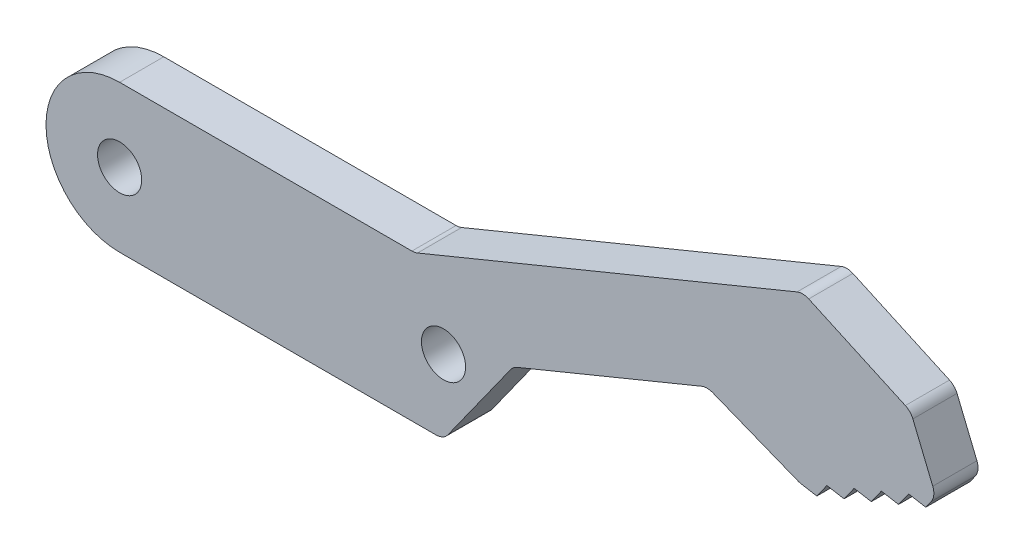
ISO-10303-21;
HEADER;
FILE_DESCRIPTION(('STEP AP214'),'2;1');
FILE_NAME('part.step','',(''),(''),'','','');
FILE_SCHEMA(('AUTOMOTIVE_DESIGN { 1 0 10303 214 1 1 1 1 }'));
ENDSEC;
DATA;
#1=APPLICATION_CONTEXT('core data for automotive mechanical design processes');
#2=APPLICATION_PROTOCOL_DEFINITION('international standard','automotive_design',2000,#1);
#3=PRODUCT_CONTEXT('',#1,'mechanical');
#4=PRODUCT('Part','Part','',(#3));
#5=PRODUCT_RELATED_PRODUCT_CATEGORY('part','',(#4));
#6=PRODUCT_DEFINITION_FORMATION('','',#4);
#7=PRODUCT_DEFINITION_CONTEXT('part definition',#1,'design');
#8=PRODUCT_DEFINITION('design','',#6,#7);
#9=PRODUCT_DEFINITION_SHAPE('','',#8);
#10=(LENGTH_UNIT() NAMED_UNIT(*) SI_UNIT(.MILLI.,.METRE.));
#11=(NAMED_UNIT(*) PLANE_ANGLE_UNIT() SI_UNIT($,.RADIAN.));
#12=(NAMED_UNIT(*) SI_UNIT($,.STERADIAN.) SOLID_ANGLE_UNIT());
#13=UNCERTAINTY_MEASURE_WITH_UNIT(LENGTH_MEASURE(1.E-05),#10,'distance_accuracy_value','');
#14=(GEOMETRIC_REPRESENTATION_CONTEXT(3) GLOBAL_UNCERTAINTY_ASSIGNED_CONTEXT((#13)) GLOBAL_UNIT_ASSIGNED_CONTEXT((#10,
#11,#12)) REPRESENTATION_CONTEXT('',''));
#15=CARTESIAN_POINT('',(0.,0.,0.));
#16=DIRECTION('',(0.,0.,1.));
#17=DIRECTION('',(1.,0.,0.));
#18=AXIS2_PLACEMENT_3D('',#15,#16,#17);
#19=CARTESIAN_POINT('',(16.9314341640703,-12.0952117619832,3.));
#20=DIRECTION('',(0.8137032336516,-0.581280523968359,0.));
#21=DIRECTION('',(0.581280523968359,0.8137032336516,0.));
#22=AXIS2_PLACEMENT_3D('',#19,#20,#21);
#23=PLANE('',#22);
#24=DIRECTION('',(-0.581280523968359,-0.8137032336516,0.));
#25=VECTOR('',#24,1.);
#26=CARTESIAN_POINT('',(16.9314341640703,-12.0952117619832,0.));
#27=LINE('',#26,#25);
#28=CARTESIAN_POINT('',(26.562618493048,1.38696338278455,0.));
#29=VERTEX_POINT('',#28);
#30=CARTESIAN_POINT('',(22.2991182366711,-4.58128052396836,0.));
#31=VERTEX_POINT('',#30);
#32=EDGE_CURVE('E359',#29,#31,#27,.T.);
#33=ORIENTED_EDGE('',*,*,#32,.F.);
#34=DIRECTION('',(0.,0.,-1.));
#35=VECTOR('',#34,1.);
#36=CARTESIAN_POINT('',(26.562618493048,1.38696338278455,3.));
#37=LINE('',#36,#35);
#38=CARTESIAN_POINT('',(26.562618493048,1.38696338278455,3.));
#39=VERTEX_POINT('',#38);
#40=EDGE_CURVE('E338',#29,#39,#37,.F.);
#41=ORIENTED_EDGE('',*,*,#40,.T.);
#42=DIRECTION('',(-0.581280523968359,-0.8137032336516,0.));
#43=VECTOR('',#42,1.);
#44=CARTESIAN_POINT('',(16.9314341640703,-12.0952117619832,3.));
#45=LINE('',#44,#43);
#46=CARTESIAN_POINT('',(22.2991182366711,-4.58128052396836,3.));
#47=VERTEX_POINT('',#46);
#48=EDGE_CURVE('E378',#39,#47,#45,.T.);
#49=ORIENTED_EDGE('',*,*,#48,.T.);
#50=DIRECTION('',(0.,0.,-1.));
#51=VECTOR('',#50,1.);
#52=CARTESIAN_POINT('',(22.2991182366711,-4.58128052396836,0.));
#53=LINE('',#52,#51);
#54=EDGE_CURVE('E334',#47,#31,#53,.T.);
#55=ORIENTED_EDGE('',*,*,#54,.T.);
#56=EDGE_LOOP('',(#33,#41,#49,#55));
#57=FACE_BOUND('',#56,.T.);
#58=ADVANCED_FACE('F42',(#57),#23,.T.);
#59=CARTESIAN_POINT('',(3.29500338314019,-8.0141207088459,3.));
#60=DIRECTION('',(0.380263412733194,-0.924878228166554,0.));
#61=DIRECTION('',(0.924878228166554,0.380263412733194,0.));
#62=AXIS2_PLACEMENT_3D('',#59,#60,#61);
#63=PLANE('',#62);
#64=DIRECTION('',(-0.924878228166555,-0.380263412733194,0.));
#65=VECTOR('',#64,1.);
#66=CARTESIAN_POINT('',(3.29500338314019,-8.0141207088459,0.));
#67=LINE('',#66,#65);
#68=CARTESIAN_POINT('',(39.526489329326,6.88244413040154,0.));
#69=VERTEX_POINT('',#68);
#70=CARTESIAN_POINT('',(26.9960583139664,1.73056108698275,0.));
#71=VERTEX_POINT('',#70);
#72=EDGE_CURVE('E361',#69,#71,#67,.T.);
#73=ORIENTED_EDGE('',*,*,#72,.F.);
#74=DIRECTION('',(0.,0.,-1.));
#75=VECTOR('',#74,1.);
#76=CARTESIAN_POINT('',(39.526489329326,6.88244413040154,3.));
#77=LINE('',#76,#75);
#78=CARTESIAN_POINT('',(39.526489329326,6.88244413040154,3.));
#79=VERTEX_POINT('',#78);
#80=EDGE_CURVE('E331',#69,#79,#77,.F.);
#81=ORIENTED_EDGE('',*,*,#80,.T.);
#82=DIRECTION('',(-0.924878228166555,-0.380263412733194,0.));
#83=VECTOR('',#82,1.);
#84=CARTESIAN_POINT('',(3.29500338314019,-8.0141207088459,3.));
#85=LINE('',#84,#83);
#86=CARTESIAN_POINT('',(26.9960583139664,1.73056108698275,3.));
#87=VERTEX_POINT('',#86);
#88=EDGE_CURVE('E376',#79,#87,#85,.T.);
#89=ORIENTED_EDGE('',*,*,#88,.T.);
#90=DIRECTION('',(0.,0.,-1.));
#91=VECTOR('',#90,1.);
#92=CARTESIAN_POINT('',(26.9960583139664,1.73056108698274,0.));
#93=LINE('',#92,#91);
#94=EDGE_CURVE('E327',#87,#71,#93,.T.);
#95=ORIENTED_EDGE('',*,*,#94,.T.);
#96=EDGE_LOOP('',(#73,#81,#89,#95));
#97=FACE_BOUND('',#96,.T.);
#98=ADVANCED_FACE('F380',(#97),#63,.T.);
#99=CARTESIAN_POINT('',(7.84369243763677,19.7605066346558,3.));
#100=DIRECTION('',(-0.368935795459596,-0.929454882621311,0.));
#101=DIRECTION('',(0.929454882621311,-0.368935795459596,0.));
#102=AXIS2_PLACEMENT_3D('',#99,#100,#101);
#103=PLANE('',#102);
#104=DIRECTION('',(-0.929454882621311,0.368935795459596,0.));
#105=VECTOR('',#104,1.);
#106=CARTESIAN_POINT('',(7.84369243763677,19.7605066346558,0.));
#107=LINE('',#106,#105);
#108=CARTESIAN_POINT('',(46.0925277874036,4.57809729018979,0.));
#109=VERTEX_POINT('',#108);
#110=CARTESIAN_POINT('',(40.2756885375188,6.88702078485629,0.));
#111=VERTEX_POINT('',#110);
#112=EDGE_CURVE('E454',#109,#111,#107,.T.);
#113=ORIENTED_EDGE('',*,*,#112,.F.);
#114=DIRECTION('',(0.,0.,-1.));
#115=VECTOR('',#114,1.);
#116=CARTESIAN_POINT('',(46.0925277874036,4.5780972901898,3.));
#117=LINE('',#116,#115);
#118=CARTESIAN_POINT('',(46.0925277874036,4.57809729018979,3.));
#119=VERTEX_POINT('',#118);
#120=EDGE_CURVE('E282',#109,#119,#117,.F.);
#121=ORIENTED_EDGE('',*,*,#120,.T.);
#122=DIRECTION('',(-0.929454882621311,0.368935795459596,0.));
#123=VECTOR('',#122,1.);
#124=CARTESIAN_POINT('',(7.84369243763677,19.7605066346558,3.));
#125=LINE('',#124,#123);
#126=CARTESIAN_POINT('',(40.2756885375188,6.88702078485629,3.));
#127=VERTEX_POINT('',#126);
#128=EDGE_CURVE('E237',#119,#127,#125,.T.);
#129=ORIENTED_EDGE('',*,*,#128,.T.);
#130=DIRECTION('',(0.,0.,-1.));
#131=VECTOR('',#130,1.);
#132=CARTESIAN_POINT('',(40.2756885375188,6.8870207848563,0.));
#133=LINE('',#132,#131);
#134=EDGE_CURVE('E278',#127,#111,#133,.T.);
#135=ORIENTED_EDGE('',*,*,#134,.T.);
#136=EDGE_LOOP('',(#113,#121,#129,#135));
#137=FACE_BOUND('',#136,.T.);
#138=ADVANCED_FACE('F633',(#137),#103,.T.);
#139=CARTESIAN_POINT('',(2.12068725055289,12.2001062019432,3.));
#140=DIRECTION('',(0.171257275030384,0.98522634239507,0.));
#141=DIRECTION('',(-0.98522634239507,0.171257275030384,0.));
#142=AXIS2_PLACEMENT_3D('',#139,#140,#141);
#143=PLANE('',#142);
#144=DIRECTION('',(0.98522634239507,-0.171257275030384,0.));
#145=VECTOR('',#144,1.);
#146=CARTESIAN_POINT('',(2.12068725055289,12.2001062019432,3.));
#147=LINE('',#146,#145);
#148=CARTESIAN_POINT('',(46.2902063078328,4.52232583041604,3.));
#149=VERTEX_POINT('',#148);
#150=CARTESIAN_POINT('',(47.3529322035688,4.33759717145069,3.));
#151=VERTEX_POINT('',#150);
#152=EDGE_CURVE('E223',#149,#151,#147,.T.);
#153=ORIENTED_EDGE('',*,*,#152,.F.);
#154=DIRECTION('',(0.,0.,-1.));
#155=VECTOR('',#154,1.);
#156=CARTESIAN_POINT('',(46.2902063078328,4.52232583041604,0.));
#157=LINE('',#156,#155);
#158=CARTESIAN_POINT('',(46.2902063078328,4.52232583041604,0.));
#159=VERTEX_POINT('',#158);
#160=EDGE_CURVE('E254',#149,#159,#157,.T.);
#161=ORIENTED_EDGE('',*,*,#160,.T.);
#162=DIRECTION('',(0.98522634239507,-0.171257275030384,0.));
#163=VECTOR('',#162,1.);
#164=CARTESIAN_POINT('',(2.12068725055289,12.2001062019432,0.));
#165=LINE('',#164,#163);
#166=CARTESIAN_POINT('',(47.3529322035688,4.33759717145069,0.));
#167=VERTEX_POINT('',#166);
#168=EDGE_CURVE('E251',#159,#167,#165,.T.);
#169=ORIENTED_EDGE('',*,*,#168,.T.);
#170=DIRECTION('',(0.,0.,-1.));
#171=VECTOR('',#170,1.);
#172=CARTESIAN_POINT('',(47.3529322035688,4.33759717145069,3.));
#173=LINE('',#172,#171);
#174=EDGE_CURVE('E243',#151,#167,#173,.T.);
#175=ORIENTED_EDGE('',*,*,#174,.F.);
#176=EDGE_LOOP('',(#153,#161,#169,#175));
#177=FACE_BOUND('',#176,.T.);
#178=ADVANCED_FACE('F249',(#177),#143,.F.);
#179=CARTESIAN_POINT('',(29.3832302084343,-20.9117468542213,3.));
#180=DIRECTION('',(-0.814732571298563,0.579836905746117,0.));
#181=DIRECTION('',(-0.579836905746118,-0.814732571298563,0.));
#182=AXIS2_PLACEMENT_3D('',#179,#180,#181);
#183=PLANE('',#182);
#184=DIRECTION('',(0.579836905746117,0.814732571298563,0.));
#185=VECTOR('',#184,1.);
#186=CARTESIAN_POINT('',(29.3832302084343,-20.9117468542213,0.));
#187=LINE('',#186,#185);
#188=CARTESIAN_POINT('',(48.0382444817135,5.30053386792882,0.));
#189=VERTEX_POINT('',#188);
#190=EDGE_CURVE('E460',#167,#189,#187,.T.);
#191=ORIENTED_EDGE('',*,*,#190,.T.);
#192=DIRECTION('',(0.,0.,-1.));
#193=VECTOR('',#192,1.);
#194=CARTESIAN_POINT('',(48.0382444817135,5.30053386792882,3.));
#195=LINE('',#194,#193);
#196=CARTESIAN_POINT('',(48.0382444817135,5.30053386792882,3.));
#197=VERTEX_POINT('',#196);
#198=EDGE_CURVE('E245',#197,#189,#195,.T.);
#199=ORIENTED_EDGE('',*,*,#198,.F.);
#200=DIRECTION('',(0.579836905746117,0.814732571298563,0.));
#201=VECTOR('',#200,1.);
#202=CARTESIAN_POINT('',(29.3832302084343,-20.9117468542213,3.));
#203=LINE('',#202,#201);
#204=EDGE_CURVE('E228',#151,#197,#203,.T.);
#205=ORIENTED_EDGE('',*,*,#204,.F.);
#206=ORIENTED_EDGE('',*,*,#174,.T.);
#207=EDGE_LOOP('',(#191,#199,#205,#206));
#208=FACE_BOUND('',#207,.T.);
#209=ADVANCED_FACE('F242',(#208),#183,.F.);
#210=CARTESIAN_POINT('',(2.30326040358799,13.2504316830208,3.));
#211=DIRECTION('',(0.171257275030382,0.98522634239507,0.));
#212=DIRECTION('',(-0.98522634239507,0.171257275030382,0.));
#213=AXIS2_PLACEMENT_3D('',#210,#211,#212);
#214=PLANE('',#213);
#215=DIRECTION('',(0.98522634239507,-0.171257275030382,0.));
#216=VECTOR('',#215,1.);
#217=CARTESIAN_POINT('',(2.30326040358799,13.2504316830208,0.));
#218=LINE('',#217,#216);
#219=CARTESIAN_POINT('',(49.2026886599019,5.09812399691708,0.));
#220=VERTEX_POINT('',#219);
#221=EDGE_CURVE('E463',#189,#220,#218,.T.);
#222=ORIENTED_EDGE('',*,*,#221,.T.);
#223=DIRECTION('',(0.,0.,-1.));
#224=VECTOR('',#223,1.);
#225=CARTESIAN_POINT('',(49.2026886599019,5.09812399691708,3.));
#226=LINE('',#225,#224);
#227=CARTESIAN_POINT('',(49.2026886599019,5.09812399691708,3.));
#228=VERTEX_POINT('',#227);
#229=EDGE_CURVE('E260',#228,#220,#226,.T.);
#230=ORIENTED_EDGE('',*,*,#229,.F.);
#231=DIRECTION('',(0.98522634239507,-0.171257275030382,0.));
#232=VECTOR('',#231,1.);
#233=CARTESIAN_POINT('',(2.30326040358799,13.2504316830208,3.));
#234=LINE('',#233,#232);
#235=EDGE_CURVE('E247',#197,#228,#234,.T.);
#236=ORIENTED_EDGE('',*,*,#235,.F.);
#237=ORIENTED_EDGE('',*,*,#198,.T.);
#238=EDGE_LOOP('',(#222,#230,#236,#237));
#239=FACE_BOUND('',#238,.T.);
#240=ADVANCED_FACE('F555',(#239),#214,.F.);
#241=CARTESIAN_POINT('',(30.2517964891719,-21.5298966648465,3.));
#242=DIRECTION('',(-0.814732571298563,0.579836905746117,0.));
#243=DIRECTION('',(-0.579836905746117,-0.814732571298563,0.));
#244=AXIS2_PLACEMENT_3D('',#241,#242,#243);
#245=PLANE('',#244);
#246=DIRECTION('',(0.579836905746117,0.814732571298563,0.));
#247=VECTOR('',#246,1.);
#248=CARTESIAN_POINT('',(30.2517964891719,-21.5298966648465,0.));
#249=LINE('',#248,#247);
#250=CARTESIAN_POINT('',(49.8880009380466,6.0610606933952,0.));
#251=VERTEX_POINT('',#250);
#252=EDGE_CURVE('E467',#220,#251,#249,.T.);
#253=ORIENTED_EDGE('',*,*,#252,.T.);
#254=DIRECTION('',(0.,0.,-1.));
#255=VECTOR('',#254,1.);
#256=CARTESIAN_POINT('',(49.8880009380466,6.0610606933952,3.));
#257=LINE('',#256,#255);
#258=CARTESIAN_POINT('',(49.8880009380466,6.0610606933952,3.));
#259=VERTEX_POINT('',#258);
#260=EDGE_CURVE('E545',#259,#251,#257,.T.);
#261=ORIENTED_EDGE('',*,*,#260,.F.);
#262=DIRECTION('',(0.579836905746117,0.814732571298563,0.));
#263=VECTOR('',#262,1.);
#264=CARTESIAN_POINT('',(30.2517964891719,-21.5298966648465,3.));
#265=LINE('',#264,#263);
#266=EDGE_CURVE('E394',#228,#259,#265,.T.);
#267=ORIENTED_EDGE('',*,*,#266,.F.);
#268=ORIENTED_EDGE('',*,*,#229,.T.);
#269=EDGE_LOOP('',(#253,#261,#267,#268));
#270=FACE_BOUND('',#269,.T.);
#271=ADVANCED_FACE('F552',(#270),#245,.F.);
#272=CARTESIAN_POINT('',(2.48583355662316,14.3007571640986,3.));
#273=DIRECTION('',(0.171257275030384,0.98522634239507,0.));
#274=DIRECTION('',(-0.98522634239507,0.171257275030384,0.));
#275=AXIS2_PLACEMENT_3D('',#272,#273,#274);
#276=PLANE('',#275);
#277=DIRECTION('',(0.98522634239507,-0.171257275030384,0.));
#278=VECTOR('',#277,1.);
#279=CARTESIAN_POINT('',(2.48583355662316,14.3007571640986,0.));
#280=LINE('',#279,#278);
#281=CARTESIAN_POINT('',(51.052445116235,5.85865082238346,0.));
#282=VERTEX_POINT('',#281);
#283=EDGE_CURVE('E471',#251,#282,#280,.T.);
#284=ORIENTED_EDGE('',*,*,#283,.T.);
#285=DIRECTION('',(0.,0.,-1.));
#286=VECTOR('',#285,1.);
#287=CARTESIAN_POINT('',(51.052445116235,5.85865082238346,3.));
#288=LINE('',#287,#286);
#289=CARTESIAN_POINT('',(51.052445116235,5.85865082238346,3.));
#290=VERTEX_POINT('',#289);
#291=EDGE_CURVE('E541',#290,#282,#288,.T.);
#292=ORIENTED_EDGE('',*,*,#291,.F.);
#293=DIRECTION('',(0.98522634239507,-0.171257275030384,0.));
#294=VECTOR('',#293,1.);
#295=CARTESIAN_POINT('',(2.48583355662316,14.3007571640986,3.));
#296=LINE('',#295,#294);
#297=EDGE_CURVE('E398',#259,#290,#296,.T.);
#298=ORIENTED_EDGE('',*,*,#297,.F.);
#299=ORIENTED_EDGE('',*,*,#260,.T.);
#300=EDGE_LOOP('',(#284,#292,#298,#299));
#301=FACE_BOUND('',#300,.T.);
#302=ADVANCED_FACE('F558',(#301),#276,.F.);
#303=CARTESIAN_POINT('',(31.1203627699096,-22.1480464754716,3.));
#304=DIRECTION('',(-0.814732571298563,0.579836905746117,0.));
#305=DIRECTION('',(-0.579836905746117,-0.814732571298563,0.));
#306=AXIS2_PLACEMENT_3D('',#303,#304,#305);
#307=PLANE('',#306);
#308=DIRECTION('',(0.579836905746117,0.814732571298563,0.));
#309=VECTOR('',#308,1.);
#310=CARTESIAN_POINT('',(31.1203627699096,-22.1480464754716,0.));
#311=LINE('',#310,#309);
#312=CARTESIAN_POINT('',(51.7377573943797,6.82158751886158,0.));
#313=VERTEX_POINT('',#312);
#314=EDGE_CURVE('E475',#282,#313,#311,.T.);
#315=ORIENTED_EDGE('',*,*,#314,.T.);
#316=DIRECTION('',(0.,0.,-1.));
#317=VECTOR('',#316,1.);
#318=CARTESIAN_POINT('',(51.7377573943797,6.82158751886158,3.));
#319=LINE('',#318,#317);
#320=CARTESIAN_POINT('',(51.7377573943797,6.82158751886158,3.));
#321=VERTEX_POINT('',#320);
#322=EDGE_CURVE('E537',#321,#313,#319,.T.);
#323=ORIENTED_EDGE('',*,*,#322,.F.);
#324=DIRECTION('',(0.579836905746117,0.814732571298563,0.));
#325=VECTOR('',#324,1.);
#326=CARTESIAN_POINT('',(31.1203627699096,-22.1480464754716,3.));
#327=LINE('',#326,#325);
#328=EDGE_CURVE('E402',#290,#321,#327,.T.);
#329=ORIENTED_EDGE('',*,*,#328,.F.);
#330=ORIENTED_EDGE('',*,*,#291,.T.);
#331=EDGE_LOOP('',(#315,#323,#329,#330));
#332=FACE_BOUND('',#331,.T.);
#333=ADVANCED_FACE('F562',(#332),#307,.F.);
#334=CARTESIAN_POINT('',(2.66840670965835,15.3510826451764,3.));
#335=DIRECTION('',(0.171257275030386,0.985226342395069,0.));
#336=DIRECTION('',(-0.98522634239507,0.171257275030386,0.));
#337=AXIS2_PLACEMENT_3D('',#334,#335,#336);
#338=PLANE('',#337);
#339=DIRECTION('',(0.98522634239507,-0.171257275030386,0.));
#340=VECTOR('',#339,1.);
#341=CARTESIAN_POINT('',(2.66840670965835,15.3510826451764,0.));
#342=LINE('',#341,#340);
#343=CARTESIAN_POINT('',(52.9022015725681,6.61917764784984,0.));
#344=VERTEX_POINT('',#343);
#345=EDGE_CURVE('E479',#313,#344,#342,.T.);
#346=ORIENTED_EDGE('',*,*,#345,.T.);
#347=DIRECTION('',(0.,0.,-1.));
#348=VECTOR('',#347,1.);
#349=CARTESIAN_POINT('',(52.9022015725681,6.61917764784984,3.));
#350=LINE('',#349,#348);
#351=CARTESIAN_POINT('',(52.9022015725681,6.61917764784984,3.));
#352=VERTEX_POINT('',#351);
#353=EDGE_CURVE('E533',#352,#344,#350,.T.);
#354=ORIENTED_EDGE('',*,*,#353,.F.);
#355=DIRECTION('',(0.98522634239507,-0.171257275030386,0.));
#356=VECTOR('',#355,1.);
#357=CARTESIAN_POINT('',(2.66840670965835,15.3510826451764,3.));
#358=LINE('',#357,#356);
#359=EDGE_CURVE('E406',#321,#352,#358,.T.);
#360=ORIENTED_EDGE('',*,*,#359,.F.);
#361=ORIENTED_EDGE('',*,*,#322,.T.);
#362=EDGE_LOOP('',(#346,#354,#360,#361));
#363=FACE_BOUND('',#362,.T.);
#364=ADVANCED_FACE('F564',(#363),#338,.F.);
#365=CARTESIAN_POINT('',(31.9889290506473,-22.7661962860967,3.));
#366=DIRECTION('',(-0.814732571298563,0.579836905746117,0.));
#367=DIRECTION('',(-0.579836905746117,-0.814732571298563,0.));
#368=AXIS2_PLACEMENT_3D('',#365,#366,#367);
#369=PLANE('',#368);
#370=DIRECTION('',(0.579836905746117,0.814732571298563,0.));
#371=VECTOR('',#370,1.);
#372=CARTESIAN_POINT('',(31.9889290506473,-22.7661962860967,0.));
#373=LINE('',#372,#371);
#374=CARTESIAN_POINT('',(53.5875138507128,7.58211434432796,0.));
#375=VERTEX_POINT('',#374);
#376=EDGE_CURVE('E483',#344,#375,#373,.T.);
#377=ORIENTED_EDGE('',*,*,#376,.T.);
#378=DIRECTION('',(0.,0.,-1.));
#379=VECTOR('',#378,1.);
#380=CARTESIAN_POINT('',(53.5875138507128,7.58211434432796,3.));
#381=LINE('',#380,#379);
#382=CARTESIAN_POINT('',(53.5875138507128,7.58211434432796,3.));
#383=VERTEX_POINT('',#382);
#384=EDGE_CURVE('E529',#383,#375,#381,.T.);
#385=ORIENTED_EDGE('',*,*,#384,.F.);
#386=DIRECTION('',(0.579836905746117,0.814732571298563,0.));
#387=VECTOR('',#386,1.);
#388=CARTESIAN_POINT('',(31.9889290506473,-22.7661962860967,3.));
#389=LINE('',#388,#387);
#390=EDGE_CURVE('E410',#352,#383,#389,.T.);
#391=ORIENTED_EDGE('',*,*,#390,.F.);
#392=ORIENTED_EDGE('',*,*,#353,.T.);
#393=EDGE_LOOP('',(#377,#385,#391,#392));
#394=FACE_BOUND('',#393,.T.);
#395=ADVANCED_FACE('F566',(#394),#369,.F.);
#396=CARTESIAN_POINT('',(2.85097986269346,16.4014081262541,3.));
#397=DIRECTION('',(0.171257275030384,0.98522634239507,0.));
#398=DIRECTION('',(-0.98522634239507,0.171257275030384,0.));
#399=AXIS2_PLACEMENT_3D('',#396,#397,#398);
#400=PLANE('',#399);
#401=DIRECTION('',(0.98522634239507,-0.171257275030384,0.));
#402=VECTOR('',#401,1.);
#403=CARTESIAN_POINT('',(2.85097986269346,16.4014081262541,0.));
#404=LINE('',#403,#402);
#405=CARTESIAN_POINT('',(54.7519580289012,7.37970447331622,0.));
#406=VERTEX_POINT('',#405);
#407=EDGE_CURVE('E487',#375,#406,#404,.T.);
#408=ORIENTED_EDGE('',*,*,#407,.T.);
#409=DIRECTION('',(0.,0.,-1.));
#410=VECTOR('',#409,1.);
#411=CARTESIAN_POINT('',(54.7519580289012,7.37970447331622,3.));
#412=LINE('',#411,#410);
#413=CARTESIAN_POINT('',(54.7519580289012,7.37970447331622,3.));
#414=VERTEX_POINT('',#413);
#415=EDGE_CURVE('E525',#414,#406,#412,.T.);
#416=ORIENTED_EDGE('',*,*,#415,.F.);
#417=DIRECTION('',(0.98522634239507,-0.171257275030384,0.));
#418=VECTOR('',#417,1.);
#419=CARTESIAN_POINT('',(2.85097986269346,16.4014081262541,3.));
#420=LINE('',#419,#418);
#421=EDGE_CURVE('E414',#383,#414,#420,.T.);
#422=ORIENTED_EDGE('',*,*,#421,.F.);
#423=ORIENTED_EDGE('',*,*,#384,.T.);
#424=EDGE_LOOP('',(#408,#416,#422,#423));
#425=FACE_BOUND('',#424,.T.);
#426=ADVANCED_FACE('F571',(#425),#400,.F.);
#427=CARTESIAN_POINT('',(32.8574953313838,-23.3843460967221,3.));
#428=DIRECTION('',(-0.814732571298552,0.579836905746133,0.));
#429=DIRECTION('',(-0.579836905746133,-0.814732571298552,0.));
#430=AXIS2_PLACEMENT_3D('',#427,#428,#429);
#431=PLANE('',#430);
#432=DIRECTION('',(0.579836905746133,0.814732571298552,0.));
#433=VECTOR('',#432,1.);
#434=CARTESIAN_POINT('',(32.8574953313838,-23.3843460967221,0.));
#435=LINE('',#434,#433);
#436=CARTESIAN_POINT('',(55.1172552795213,7.89298599323432,0.));
#437=VERTEX_POINT('',#436);
#438=EDGE_CURVE('E491',#406,#437,#435,.T.);
#439=ORIENTED_EDGE('',*,*,#438,.T.);
#440=DIRECTION('',(0.,0.,-1.));
#441=VECTOR('',#440,1.);
#442=CARTESIAN_POINT('',(55.1172552795213,7.89298599323432,3.));
#443=LINE('',#442,#441);
#444=CARTESIAN_POINT('',(55.1172552795213,7.89298599323432,3.));
#445=VERTEX_POINT('',#444);
#446=EDGE_CURVE('E306',#437,#445,#443,.F.);
#447=ORIENTED_EDGE('',*,*,#446,.T.);
#448=DIRECTION('',(0.579836905746133,0.814732571298552,0.));
#449=VECTOR('',#448,1.);
#450=CARTESIAN_POINT('',(32.8574953313838,-23.3843460967221,3.));
#451=LINE('',#450,#449);
#452=EDGE_CURVE('E418',#414,#445,#451,.T.);
#453=ORIENTED_EDGE('',*,*,#452,.F.);
#454=ORIENTED_EDGE('',*,*,#415,.T.);
#455=EDGE_LOOP('',(#439,#447,#453,#454));
#456=FACE_BOUND('',#455,.T.);
#457=ADVANCED_FACE('F573',(#456),#431,.F.);
#458=CARTESIAN_POINT('',(50.3551112402661,20.7034892439211,3.));
#459=DIRECTION('',(0.924878228166555,0.380263412733191,0.));
#460=DIRECTION('',(-0.380263412733191,0.924878228166555,0.));
#461=AXIS2_PLACEMENT_3D('',#458,#459,#460);
#462=PLANE('',#461);
#463=DIRECTION('',(0.380263412733191,-0.924878228166555,0.));
#464=VECTOR('',#463,1.);
#465=CARTESIAN_POINT('',(50.3551112402661,20.7034892439211,3.));
#466=LINE('',#465,#464);
#467=CARTESIAN_POINT('',(53.8764912996727,12.1387742569175,3.));
#468=VERTEX_POINT('',#467);
#469=CARTESIAN_POINT('',(55.2274009363893,8.85308631171364,3.));
#470=VERTEX_POINT('',#469);
#471=EDGE_CURVE('E422',#468,#470,#466,.T.);
#472=ORIENTED_EDGE('',*,*,#471,.T.);
#473=DIRECTION('',(0.,0.,-1.));
#474=VECTOR('',#473,1.);
#475=CARTESIAN_POINT('',(55.2274009363893,8.85308631171364,0.));
#476=LINE('',#475,#474);
#477=CARTESIAN_POINT('',(55.2274009363893,8.85308631171364,0.));
#478=VERTEX_POINT('',#477);
#479=EDGE_CURVE('E302',#470,#478,#476,.T.);
#480=ORIENTED_EDGE('',*,*,#479,.T.);
#481=DIRECTION('',(0.380263412733191,-0.924878228166555,0.));
#482=VECTOR('',#481,1.);
#483=CARTESIAN_POINT('',(50.3551112402661,20.7034892439211,0.));
#484=LINE('',#483,#482);
#485=CARTESIAN_POINT('',(53.8764912996727,12.1387742569175,0.));
#486=VERTEX_POINT('',#485);
#487=EDGE_CURVE('E495',#486,#478,#484,.T.);
#488=ORIENTED_EDGE('',*,*,#487,.F.);
#489=DIRECTION('',(0.,0.,-1.));
#490=VECTOR('',#489,1.);
#491=CARTESIAN_POINT('',(53.8764912996727,12.1387742569175,3.));
#492=LINE('',#491,#490);
#493=EDGE_CURVE('E299',#486,#468,#492,.F.);
#494=ORIENTED_EDGE('',*,*,#493,.T.);
#495=EDGE_LOOP('',(#472,#480,#488,#494));
#496=FACE_BOUND('',#495,.T.);
#497=ADVANCED_FACE('F581',(#496),#462,.T.);
#498=CARTESIAN_POINT('',(13.9488099268588,30.6231164748254,3.));
#499=DIRECTION('',(0.4145222599321,0.910039172794658,0.));
#500=DIRECTION('',(-0.910039172794658,0.4145222599321,0.));
#501=AXIS2_PLACEMENT_3D('',#498,#499,#500);
#502=PLANE('',#501);
#503=DIRECTION('',(0.910039172794658,-0.4145222599321,0.));
#504=VECTOR('',#503,1.);
#505=CARTESIAN_POINT('',(13.9488099268588,30.6231164748254,3.));
#506=LINE('',#505,#504);
#507=CARTESIAN_POINT('',(46.8032086062435,15.6579589338964,3.));
#508=VERTEX_POINT('',#507);
#509=CARTESIAN_POINT('',(53.3661353314383,12.668550016979,3.));
#510=VERTEX_POINT('',#509);
#511=EDGE_CURVE('E426',#508,#510,#506,.T.);
#512=ORIENTED_EDGE('',*,*,#511,.T.);
#513=DIRECTION('',(0.,0.,-1.));
#514=VECTOR('',#513,1.);
#515=CARTESIAN_POINT('',(53.3661353314383,12.668550016979,3.));
#516=LINE('',#515,#514);
#517=CARTESIAN_POINT('',(53.3661353314383,12.668550016979,0.));
#518=VERTEX_POINT('',#517);
#519=EDGE_CURVE('E312',#510,#518,#516,.T.);
#520=ORIENTED_EDGE('',*,*,#519,.T.);
#521=DIRECTION('',(0.910039172794658,-0.4145222599321,0.));
#522=VECTOR('',#521,1.);
#523=CARTESIAN_POINT('',(13.9488099268588,30.6231164748254,0.));
#524=LINE('',#523,#522);
#525=CARTESIAN_POINT('',(46.8032086062435,15.6579589338964,0.));
#526=VERTEX_POINT('',#525);
#527=EDGE_CURVE('E499',#526,#518,#524,.T.);
#528=ORIENTED_EDGE('',*,*,#527,.F.);
#529=DIRECTION('',(0.,0.,-1.));
#530=VECTOR('',#529,1.);
#531=CARTESIAN_POINT('',(46.8032086062435,15.6579589338964,3.));
#532=LINE('',#531,#530);
#533=EDGE_CURVE('E309',#526,#508,#532,.F.);
#534=ORIENTED_EDGE('',*,*,#533,.T.);
#535=EDGE_LOOP('',(#512,#520,#528,#534));
#536=FACE_BOUND('',#535,.T.);
#537=ADVANCED_FACE('F590',(#536),#502,.T.);
#538=CARTESIAN_POINT('',(1.14074851739686,-2.7745332109926,3.));
#539=DIRECTION('',(-0.380263412733193,0.924878228166554,0.));
#540=DIRECTION('',(-0.924878228166554,-0.380263412733194,0.));
#541=AXIS2_PLACEMENT_3D('',#538,#539,#540);
#542=PLANE('',#541);
#543=DIRECTION('',(0.924878228166554,0.380263412733194,0.));
#544=VECTOR('',#543,1.);
#545=CARTESIAN_POINT('',(1.14074851739686,-2.7745332109926,3.));
#546=LINE('',#545,#544);
#547=CARTESIAN_POINT('',(20.2327114807882,5.07512177183345,3.));
#548=VERTEX_POINT('',#547);
#549=CARTESIAN_POINT('',(46.0084229335782,15.6727979892683,3.));
#550=VERTEX_POINT('',#549);
#551=EDGE_CURVE('E430',#548,#550,#546,.T.);
#552=ORIENTED_EDGE('',*,*,#551,.T.);
#553=DIRECTION('',(0.,0.,-1.));
#554=VECTOR('',#553,1.);
#555=CARTESIAN_POINT('',(46.0084229335782,15.6727979892683,3.));
#556=LINE('',#555,#554);
#557=CARTESIAN_POINT('',(46.0084229335782,15.6727979892683,0.));
#558=VERTEX_POINT('',#557);
#559=EDGE_CURVE('E319',#550,#558,#556,.T.);
#560=ORIENTED_EDGE('',*,*,#559,.T.);
#561=DIRECTION('',(0.924878228166554,0.380263412733194,0.));
#562=VECTOR('',#561,1.);
#563=CARTESIAN_POINT('',(1.14074851739686,-2.7745332109926,0.));
#564=LINE('',#563,#562);
#565=CARTESIAN_POINT('',(20.2327114807882,5.07512177183345,0.));
#566=VERTEX_POINT('',#565);
#567=EDGE_CURVE('E503',#566,#558,#564,.T.);
#568=ORIENTED_EDGE('',*,*,#567,.F.);
#569=DIRECTION('',(0.,0.,-1.));
#570=VECTOR('',#569,1.);
#571=CARTESIAN_POINT('',(20.2327114807882,5.07512177183345,3.));
#572=LINE('',#571,#570);
#573=EDGE_CURVE('E316',#566,#548,#572,.F.);
#574=ORIENTED_EDGE('',*,*,#573,.T.);
#575=EDGE_LOOP('',(#552,#560,#568,#574));
#576=FACE_BOUND('',#575,.T.);
#577=ADVANCED_FACE('F597',(#576),#542,.T.);
#578=CARTESIAN_POINT('',(0.,5.,3.));
#579=DIRECTION('',(0.,1.,0.));
#580=DIRECTION('',(0.,0.,1.));
#581=AXIS2_PLACEMENT_3D('',#578,#579,#580);
#582=PLANE('',#581);
#583=DIRECTION('',(1.,0.,0.));
#584=VECTOR('',#583,1.);
#585=CARTESIAN_POINT('',(0.,5.,3.));
#586=LINE('',#585,#584);
#587=CARTESIAN_POINT('',(0.,5.,3.));
#588=VERTEX_POINT('',#587);
#589=CARTESIAN_POINT('',(19.852448068055,5.,3.));
#590=VERTEX_POINT('',#589);
#591=EDGE_CURVE('E434',#588,#590,#586,.T.);
#592=ORIENTED_EDGE('',*,*,#591,.T.);
#593=DIRECTION('',(0.,0.,-1.));
#594=VECTOR('',#593,1.);
#595=CARTESIAN_POINT('',(19.852448068055,5.,0.));
#596=LINE('',#595,#594);
#597=CARTESIAN_POINT('',(19.852448068055,5.,0.));
#598=VERTEX_POINT('',#597);
#599=EDGE_CURVE('E323',#590,#598,#596,.T.);
#600=ORIENTED_EDGE('',*,*,#599,.T.);
#601=DIRECTION('',(1.,0.,0.));
#602=VECTOR('',#601,1.);
#603=CARTESIAN_POINT('',(0.,5.,0.));
#604=LINE('',#603,#602);
#605=CARTESIAN_POINT('',(0.,5.,0.));
#606=VERTEX_POINT('',#605);
#607=EDGE_CURVE('E507',#606,#598,#604,.T.);
#608=ORIENTED_EDGE('',*,*,#607,.F.);
#609=DIRECTION('',(0.,0.,-1.));
#610=VECTOR('',#609,1.);
#611=CARTESIAN_POINT('',(0.,5.,3.));
#612=LINE('',#611,#610);
#613=EDGE_CURVE('E522',#588,#606,#612,.T.);
#614=ORIENTED_EDGE('',*,*,#613,.F.);
#615=EDGE_LOOP('',(#592,#600,#608,#614));
#616=FACE_BOUND('',#615,.T.);
#617=ADVANCED_FACE('F605',(#616),#582,.T.);
#618=CARTESIAN_POINT('',(0.,0.,3.));
#619=DIRECTION('',(0.,0.,-1.));
#620=DIRECTION('',(-1.,0.,0.));
#621=AXIS2_PLACEMENT_3D('',#618,#619,#620);
#622=CYLINDRICAL_SURFACE('',#621,5.);
#623=CARTESIAN_POINT('',(0.,0.,0.));
#624=DIRECTION('',(0.,0.,1.));
#625=DIRECTION('',(1.,0.,0.));
#626=AXIS2_PLACEMENT_3D('',#623,#624,#625);
#627=CIRCLE('',#626,5.);
#628=CARTESIAN_POINT('',(0.,-5.,0.));
#629=VERTEX_POINT('',#628);
#630=EDGE_CURVE('E511',#606,#629,#627,.T.);
#631=ORIENTED_EDGE('',*,*,#630,.T.);
#632=DIRECTION('',(0.,0.,-1.));
#633=VECTOR('',#632,1.);
#634=CARTESIAN_POINT('',(0.,-5.,3.));
#635=LINE('',#634,#633);
#636=CARTESIAN_POINT('',(0.,-5.,3.));
#637=VERTEX_POINT('',#636);
#638=EDGE_CURVE('E444',#637,#629,#635,.T.);
#639=ORIENTED_EDGE('',*,*,#638,.F.);
#640=CARTESIAN_POINT('',(0.,0.,3.));
#641=DIRECTION('',(0.,0.,1.));
#642=DIRECTION('',(1.,0.,0.));
#643=AXIS2_PLACEMENT_3D('',#640,#641,#642);
#644=CIRCLE('',#643,5.);
#645=EDGE_CURVE('E437',#588,#637,#644,.T.);
#646=ORIENTED_EDGE('',*,*,#645,.F.);
#647=ORIENTED_EDGE('',*,*,#613,.T.);
#648=EDGE_LOOP('',(#631,#639,#646,#647));
#649=FACE_BOUND('',#648,.T.);
#650=ADVANCED_FACE('F609',(#649),#622,.T.);
#651=CARTESIAN_POINT('',(0.,0.,3.));
#652=DIRECTION('',(0.,0.,-1.));
#653=DIRECTION('',(-1.,0.,0.));
#654=AXIS2_PLACEMENT_3D('',#651,#652,#653);
#655=CYLINDRICAL_SURFACE('',#654,1.5);
#656=CARTESIAN_POINT('',(0.,0.,3.));
#657=DIRECTION('',(0.,0.,1.));
#658=DIRECTION('',(1.,0.,0.));
#659=AXIS2_PLACEMENT_3D('',#656,#657,#658);
#660=CIRCLE('',#659,1.5);
#661=CARTESIAN_POINT('',(1.5,0.,3.));
#662=VERTEX_POINT('',#661);
#663=EDGE_CURVE('E388',#662,#662,#660,.T.);
#664=ORIENTED_EDGE('',*,*,#663,.T.);
#665=EDGE_LOOP('',(#664));
#666=FACE_BOUND('',#665,.T.);
#667=CARTESIAN_POINT('',(0.,0.,0.));
#668=DIRECTION('',(0.,0.,1.));
#669=DIRECTION('',(1.,0.,0.));
#670=AXIS2_PLACEMENT_3D('',#667,#668,#669);
#671=CIRCLE('',#670,1.5);
#672=CARTESIAN_POINT('',(1.5,0.,0.));
#673=VERTEX_POINT('',#672);
#674=EDGE_CURVE('E370',#673,#673,#671,.T.);
#675=ORIENTED_EDGE('',*,*,#674,.F.);
#676=EDGE_LOOP('',(#675));
#677=FACE_BOUND('',#676,.T.);
#678=ADVANCED_FACE('F623',(#666,#677),#655,.F.);
#679=CARTESIAN_POINT('',(22.,0.,3.));
#680=DIRECTION('',(0.,0.,-1.));
#681=DIRECTION('',(-1.,0.,0.));
#682=AXIS2_PLACEMENT_3D('',#679,#680,#681);
#683=CYLINDRICAL_SURFACE('',#682,1.5);
#684=CARTESIAN_POINT('',(22.,0.,3.));
#685=DIRECTION('',(0.,0.,1.));
#686=DIRECTION('',(1.,0.,0.));
#687=AXIS2_PLACEMENT_3D('',#684,#685,#686);
#688=CIRCLE('',#687,1.5);
#689=CARTESIAN_POINT('',(23.5,0.,3.));
#690=VERTEX_POINT('',#689);
#691=EDGE_CURVE('E518',#690,#690,#688,.T.);
#692=ORIENTED_EDGE('',*,*,#691,.T.);
#693=EDGE_LOOP('',(#692));
#694=FACE_BOUND('',#693,.T.);
#695=CARTESIAN_POINT('',(22.,0.,0.));
#696=DIRECTION('',(0.,0.,1.));
#697=DIRECTION('',(1.,0.,0.));
#698=AXIS2_PLACEMENT_3D('',#695,#696,#697);
#699=CIRCLE('',#698,1.5);
#700=CARTESIAN_POINT('',(23.5,0.,0.));
#701=VERTEX_POINT('',#700);
#702=EDGE_CURVE('E445',#701,#701,#699,.T.);
#703=ORIENTED_EDGE('',*,*,#702,.F.);
#704=EDGE_LOOP('',(#703));
#705=FACE_BOUND('',#704,.T.);
#706=ADVANCED_FACE('F615',(#694,#705),#683,.F.);
#707=CARTESIAN_POINT('',(0.,-5.,3.));
#708=DIRECTION('',(0.,1.,0.));
#709=DIRECTION('',(0.,0.,1.));
#710=AXIS2_PLACEMENT_3D('',#707,#708,#709);
#711=PLANE('',#710);
#712=DIRECTION('',(1.,0.,0.));
#713=VECTOR('',#712,1.);
#714=CARTESIAN_POINT('',(0.,-5.,0.));
#715=LINE('',#714,#713);
#716=CARTESIAN_POINT('',(21.4854150030195,-5.,0.));
#717=VERTEX_POINT('',#716);
#718=EDGE_CURVE('E515',#629,#717,#715,.T.);
#719=ORIENTED_EDGE('',*,*,#718,.T.);
#720=DIRECTION('',(0.,0.,-1.));
#721=VECTOR('',#720,1.);
#722=CARTESIAN_POINT('',(21.4854150030195,-5.,3.));
#723=LINE('',#722,#721);
#724=CARTESIAN_POINT('',(21.4854150030195,-5.,3.));
#725=VERTEX_POINT('',#724);
#726=EDGE_CURVE('E58',#717,#725,#723,.F.);
#727=ORIENTED_EDGE('',*,*,#726,.T.);
#728=DIRECTION('',(1.,0.,0.));
#729=VECTOR('',#728,1.);
#730=CARTESIAN_POINT('',(0.,-5.,3.));
#731=LINE('',#730,#729);
#732=EDGE_CURVE('E441',#637,#725,#731,.T.);
#733=ORIENTED_EDGE('',*,*,#732,.F.);
#734=ORIENTED_EDGE('',*,*,#638,.T.);
#735=EDGE_LOOP('',(#719,#727,#733,#734));
#736=FACE_BOUND('',#735,.T.);
#737=ADVANCED_FACE('F613',(#736),#711,.F.);
#738=CARTESIAN_POINT('',(0.,0.,3.));
#739=DIRECTION('',(0.,0.,1.));
#740=DIRECTION('',(1.,0.,0.));
#741=AXIS2_PLACEMENT_3D('',#738,#739,#740);
#742=PLANE('',#741);
#743=ORIENTED_EDGE('',*,*,#691,.F.);
#744=EDGE_LOOP('',(#743));
#745=FACE_BOUND('',#744,.T.);
#746=ORIENTED_EDGE('',*,*,#663,.F.);
#747=EDGE_LOOP('',(#746));
#748=FACE_BOUND('',#747,.T.);
#749=ORIENTED_EDGE('',*,*,#128,.F.);
#750=CARTESIAN_POINT('',(46.4614635828632,5.50755217281111,3.));
#751=DIRECTION('',(0.,0.,1.));
#752=DIRECTION('',(1.,0.,0.));
#753=AXIS2_PLACEMENT_3D('',#750,#751,#752);
#754=CIRCLE('',#753,1.);
#755=EDGE_CURVE('E231',#119,#149,#754,.T.);
#756=ORIENTED_EDGE('',*,*,#755,.T.);
#757=ORIENTED_EDGE('',*,*,#152,.T.);
#758=ORIENTED_EDGE('',*,*,#204,.T.);
#759=ORIENTED_EDGE('',*,*,#235,.T.);
#760=ORIENTED_EDGE('',*,*,#266,.T.);
#761=ORIENTED_EDGE('',*,*,#297,.T.);
#762=ORIENTED_EDGE('',*,*,#328,.T.);
#763=ORIENTED_EDGE('',*,*,#359,.T.);
#764=ORIENTED_EDGE('',*,*,#390,.T.);
#765=ORIENTED_EDGE('',*,*,#421,.T.);
#766=ORIENTED_EDGE('',*,*,#452,.T.);
#767=CARTESIAN_POINT('',(54.3025227082227,8.47282289898045,3.));
#768=DIRECTION('',(0.,0.,1.));
#769=DIRECTION('',(1.,0.,0.));
#770=AXIS2_PLACEMENT_3D('',#767,#768,#769);
#771=CIRCLE('',#770,1.);
#772=EDGE_CURVE('E294',#445,#470,#771,.T.);
#773=ORIENTED_EDGE('',*,*,#772,.T.);
#774=ORIENTED_EDGE('',*,*,#471,.F.);
#775=CARTESIAN_POINT('',(52.9516130715062,11.7585108441843,3.));
#776=DIRECTION('',(0.,0.,1.));
#777=DIRECTION('',(1.,0.,0.));
#778=AXIS2_PLACEMENT_3D('',#775,#776,#777);
#779=CIRCLE('',#778,1.);
#780=EDGE_CURVE('E291',#468,#510,#779,.T.);
#781=ORIENTED_EDGE('',*,*,#780,.T.);
#782=ORIENTED_EDGE('',*,*,#511,.F.);
#783=CARTESIAN_POINT('',(46.3886863463114,14.7479197611018,3.));
#784=DIRECTION('',(0.,0.,1.));
#785=DIRECTION('',(1.,0.,0.));
#786=AXIS2_PLACEMENT_3D('',#783,#784,#785);
#787=CIRCLE('',#786,1.);
#788=EDGE_CURVE('E288',#508,#550,#787,.T.);
#789=ORIENTED_EDGE('',*,*,#788,.T.);
#790=ORIENTED_EDGE('',*,*,#551,.F.);
#791=CARTESIAN_POINT('',(19.852448068055,6.,3.));
#792=DIRECTION('',(0.,0.,1.));
#793=DIRECTION('',(1.,0.,0.));
#794=AXIS2_PLACEMENT_3D('',#791,#792,#793);
#795=CIRCLE('',#794,1.);
#796=EDGE_CURVE('E66',#548,#590,#795,.F.);
#797=ORIENTED_EDGE('',*,*,#796,.T.);
#798=ORIENTED_EDGE('',*,*,#591,.F.);
#799=ORIENTED_EDGE('',*,*,#645,.T.);
#800=ORIENTED_EDGE('',*,*,#732,.T.);
#801=CARTESIAN_POINT('',(21.4854150030195,-4.,3.));
#802=DIRECTION('',(0.,0.,1.));
#803=DIRECTION('',(1.,0.,0.));
#804=AXIS2_PLACEMENT_3D('',#801,#802,#803);
#805=CIRCLE('',#804,1.);
#806=EDGE_CURVE('E285',#725,#47,#805,.T.);
#807=ORIENTED_EDGE('',*,*,#806,.T.);
#808=ORIENTED_EDGE('',*,*,#48,.F.);
#809=CARTESIAN_POINT('',(27.3763217266996,0.80568285881619,3.));
#810=DIRECTION('',(0.,0.,1.));
#811=DIRECTION('',(1.,0.,0.));
#812=AXIS2_PLACEMENT_3D('',#809,#810,#811);
#813=CIRCLE('',#812,1.);
#814=EDGE_CURVE('E11',#39,#87,#813,.F.);
#815=ORIENTED_EDGE('',*,*,#814,.T.);
#816=ORIENTED_EDGE('',*,*,#88,.F.);
#817=CARTESIAN_POINT('',(39.9067527420592,5.95756590223498,3.));
#818=DIRECTION('',(0.,0.,1.));
#819=DIRECTION('',(1.,0.,0.));
#820=AXIS2_PLACEMENT_3D('',#817,#818,#819);
#821=CIRCLE('',#820,1.);
#822=EDGE_CURVE('E351',#79,#127,#821,.F.);
#823=ORIENTED_EDGE('',*,*,#822,.T.);
#824=EDGE_LOOP('',(#749,#756,#757,#758,#759,#760,#761,#762,#763,#764,#765,#766,#773,#774,#781,
#782,#789,#790,#797,#798,#799,#800,#807,#808,#815,#816,#823));
#825=FACE_BOUND('',#824,.T.);
#826=ADVANCED_FACE('F226',(#745,#748,#825),#742,.T.);
#827=CARTESIAN_POINT('',(0.,0.,0.));
#828=DIRECTION('',(0.,0.,1.));
#829=DIRECTION('',(1.,0.,0.));
#830=AXIS2_PLACEMENT_3D('',#827,#828,#829);
#831=PLANE('',#830);
#832=ORIENTED_EDGE('',*,*,#702,.T.);
#833=EDGE_LOOP('',(#832));
#834=FACE_BOUND('',#833,.T.);
#835=ORIENTED_EDGE('',*,*,#674,.T.);
#836=EDGE_LOOP('',(#835));
#837=FACE_BOUND('',#836,.T.);
#838=ORIENTED_EDGE('',*,*,#168,.F.);
#839=CARTESIAN_POINT('',(46.4614635828632,5.50755217281111,0.));
#840=DIRECTION('',(0.,0.,1.));
#841=DIRECTION('',(1.,0.,0.));
#842=AXIS2_PLACEMENT_3D('',#839,#840,#841);
#843=CIRCLE('',#842,1.);
#844=EDGE_CURVE('E275',#159,#109,#843,.F.);
#845=ORIENTED_EDGE('',*,*,#844,.T.);
#846=ORIENTED_EDGE('',*,*,#112,.T.);
#847=CARTESIAN_POINT('',(39.9067527420592,5.95756590223498,0.));
#848=DIRECTION('',(0.,0.,1.));
#849=DIRECTION('',(1.,0.,0.));
#850=AXIS2_PLACEMENT_3D('',#847,#848,#849);
#851=CIRCLE('',#850,1.);
#852=EDGE_CURVE('E348',#111,#69,#851,.T.);
#853=ORIENTED_EDGE('',*,*,#852,.T.);
#854=ORIENTED_EDGE('',*,*,#72,.T.);
#855=CARTESIAN_POINT('',(27.3763217266996,0.80568285881619,0.));
#856=DIRECTION('',(0.,0.,1.));
#857=DIRECTION('',(1.,0.,0.));
#858=AXIS2_PLACEMENT_3D('',#855,#856,#857);
#859=CIRCLE('',#858,1.);
#860=EDGE_CURVE('E51',#71,#29,#859,.T.);
#861=ORIENTED_EDGE('',*,*,#860,.T.);
#862=ORIENTED_EDGE('',*,*,#32,.T.);
#863=CARTESIAN_POINT('',(21.4854150030195,-4.,0.));
#864=DIRECTION('',(0.,0.,1.));
#865=DIRECTION('',(1.,0.,0.));
#866=AXIS2_PLACEMENT_3D('',#863,#864,#865);
#867=CIRCLE('',#866,1.);
#868=EDGE_CURVE('E258',#31,#717,#867,.F.);
#869=ORIENTED_EDGE('',*,*,#868,.T.);
#870=ORIENTED_EDGE('',*,*,#718,.F.);
#871=ORIENTED_EDGE('',*,*,#630,.F.);
#872=ORIENTED_EDGE('',*,*,#607,.T.);
#873=CARTESIAN_POINT('',(19.852448068055,6.,0.));
#874=DIRECTION('',(0.,0.,1.));
#875=DIRECTION('',(1.,0.,0.));
#876=AXIS2_PLACEMENT_3D('',#873,#874,#875);
#877=CIRCLE('',#876,1.);
#878=EDGE_CURVE('E343',#598,#566,#877,.T.);
#879=ORIENTED_EDGE('',*,*,#878,.T.);
#880=ORIENTED_EDGE('',*,*,#567,.T.);
#881=CARTESIAN_POINT('',(46.3886863463114,14.7479197611018,0.));
#882=DIRECTION('',(0.,0.,1.));
#883=DIRECTION('',(1.,0.,0.));
#884=AXIS2_PLACEMENT_3D('',#881,#882,#883);
#885=CIRCLE('',#884,1.);
#886=EDGE_CURVE('E266',#558,#526,#885,.F.);
#887=ORIENTED_EDGE('',*,*,#886,.T.);
#888=ORIENTED_EDGE('',*,*,#527,.T.);
#889=CARTESIAN_POINT('',(52.9516130715062,11.7585108441843,0.));
#890=DIRECTION('',(0.,0.,1.));
#891=DIRECTION('',(1.,0.,0.));
#892=AXIS2_PLACEMENT_3D('',#889,#890,#891);
#893=CIRCLE('',#892,1.);
#894=EDGE_CURVE('E269',#518,#486,#893,.F.);
#895=ORIENTED_EDGE('',*,*,#894,.T.);
#896=ORIENTED_EDGE('',*,*,#487,.T.);
#897=CARTESIAN_POINT('',(54.3025227082227,8.47282289898045,0.));
#898=DIRECTION('',(0.,0.,1.));
#899=DIRECTION('',(1.,0.,0.));
#900=AXIS2_PLACEMENT_3D('',#897,#898,#899);
#901=CIRCLE('',#900,1.);
#902=EDGE_CURVE('E272',#478,#437,#901,.F.);
#903=ORIENTED_EDGE('',*,*,#902,.T.);
#904=ORIENTED_EDGE('',*,*,#438,.F.);
#905=ORIENTED_EDGE('',*,*,#407,.F.);
#906=ORIENTED_EDGE('',*,*,#376,.F.);
#907=ORIENTED_EDGE('',*,*,#345,.F.);
#908=ORIENTED_EDGE('',*,*,#314,.F.);
#909=ORIENTED_EDGE('',*,*,#283,.F.);
#910=ORIENTED_EDGE('',*,*,#252,.F.);
#911=ORIENTED_EDGE('',*,*,#221,.F.);
#912=ORIENTED_EDGE('',*,*,#190,.F.);
#913=EDGE_LOOP('',(#838,#845,#846,#853,#854,#861,#862,#869,#870,#871,#872,#879,#880,#887,#888,
#895,#896,#903,#904,#905,#906,#907,#908,#909,#910,#911,#912));
#914=FACE_BOUND('',#913,.T.);
#915=ADVANCED_FACE('F358',(#834,#837,#914),#831,.F.);
#916=CARTESIAN_POINT('',(46.4614635828632,5.50755217281111,3.));
#917=DIRECTION('',(0.,0.,1.));
#918=DIRECTION('',(1.,0.,0.));
#919=AXIS2_PLACEMENT_3D('',#916,#917,#918);
#920=CYLINDRICAL_SURFACE('',#919,1.);
#921=ORIENTED_EDGE('',*,*,#755,.F.);
#922=ORIENTED_EDGE('',*,*,#120,.F.);
#923=ORIENTED_EDGE('',*,*,#844,.F.);
#924=ORIENTED_EDGE('',*,*,#160,.F.);
#925=EDGE_LOOP('',(#921,#922,#923,#924));
#926=FACE_BOUND('',#925,.T.);
#927=ADVANCED_FACE('F640',(#926),#920,.T.);
#928=CARTESIAN_POINT('',(54.3025227082227,8.47282289898045,3.));
#929=DIRECTION('',(0.,0.,1.));
#930=DIRECTION('',(1.,0.,0.));
#931=AXIS2_PLACEMENT_3D('',#928,#929,#930);
#932=CYLINDRICAL_SURFACE('',#931,1.);
#933=ORIENTED_EDGE('',*,*,#772,.F.);
#934=ORIENTED_EDGE('',*,*,#446,.F.);
#935=ORIENTED_EDGE('',*,*,#902,.F.);
#936=ORIENTED_EDGE('',*,*,#479,.F.);
#937=EDGE_LOOP('',(#933,#934,#935,#936));
#938=FACE_BOUND('',#937,.T.);
#939=ADVANCED_FACE('F576',(#938),#932,.T.);
#940=CARTESIAN_POINT('',(52.9516130715062,11.7585108441843,3.));
#941=DIRECTION('',(0.,0.,-1.));
#942=DIRECTION('',(-1.,0.,0.));
#943=AXIS2_PLACEMENT_3D('',#940,#941,#942);
#944=CYLINDRICAL_SURFACE('',#943,1.);
#945=ORIENTED_EDGE('',*,*,#780,.F.);
#946=ORIENTED_EDGE('',*,*,#493,.F.);
#947=ORIENTED_EDGE('',*,*,#894,.F.);
#948=ORIENTED_EDGE('',*,*,#519,.F.);
#949=EDGE_LOOP('',(#945,#946,#947,#948));
#950=FACE_BOUND('',#949,.T.);
#951=ADVANCED_FACE('F585',(#950),#944,.T.);
#952=CARTESIAN_POINT('',(46.3886863463114,14.7479197611018,3.));
#953=DIRECTION('',(0.,0.,-1.));
#954=DIRECTION('',(-1.,0.,0.));
#955=AXIS2_PLACEMENT_3D('',#952,#953,#954);
#956=CYLINDRICAL_SURFACE('',#955,1.);
#957=ORIENTED_EDGE('',*,*,#788,.F.);
#958=ORIENTED_EDGE('',*,*,#533,.F.);
#959=ORIENTED_EDGE('',*,*,#886,.F.);
#960=ORIENTED_EDGE('',*,*,#559,.F.);
#961=EDGE_LOOP('',(#957,#958,#959,#960));
#962=FACE_BOUND('',#961,.T.);
#963=ADVANCED_FACE('F594',(#962),#956,.T.);
#964=CARTESIAN_POINT('',(19.852448068055,6.,3.));
#965=DIRECTION('',(0.,0.,1.));
#966=DIRECTION('',(1.,0.,0.));
#967=AXIS2_PLACEMENT_3D('',#964,#965,#966);
#968=CYLINDRICAL_SURFACE('',#967,1.);
#969=ORIENTED_EDGE('',*,*,#796,.F.);
#970=ORIENTED_EDGE('',*,*,#573,.F.);
#971=ORIENTED_EDGE('',*,*,#878,.F.);
#972=ORIENTED_EDGE('',*,*,#599,.F.);
#973=EDGE_LOOP('',(#969,#970,#971,#972));
#974=FACE_BOUND('',#973,.T.);
#975=ADVANCED_FACE('F601',(#974),#968,.F.);
#976=CARTESIAN_POINT('',(39.9067527420592,5.95756590223498,3.));
#977=DIRECTION('',(0.,0.,1.));
#978=DIRECTION('',(1.,0.,0.));
#979=AXIS2_PLACEMENT_3D('',#976,#977,#978);
#980=CYLINDRICAL_SURFACE('',#979,1.);
#981=ORIENTED_EDGE('',*,*,#822,.F.);
#982=ORIENTED_EDGE('',*,*,#80,.F.);
#983=ORIENTED_EDGE('',*,*,#852,.F.);
#984=ORIENTED_EDGE('',*,*,#134,.F.);
#985=EDGE_LOOP('',(#981,#982,#983,#984));
#986=FACE_BOUND('',#985,.T.);
#987=ADVANCED_FACE('F652',(#986),#980,.F.);
#988=CARTESIAN_POINT('',(27.3763217266996,0.80568285881619,3.));
#989=DIRECTION('',(0.,0.,1.));
#990=DIRECTION('',(1.,0.,0.));
#991=AXIS2_PLACEMENT_3D('',#988,#989,#990);
#992=CYLINDRICAL_SURFACE('',#991,1.);
#993=ORIENTED_EDGE('',*,*,#814,.F.);
#994=ORIENTED_EDGE('',*,*,#40,.F.);
#995=ORIENTED_EDGE('',*,*,#860,.F.);
#996=ORIENTED_EDGE('',*,*,#94,.F.);
#997=EDGE_LOOP('',(#993,#994,#995,#996));
#998=FACE_BOUND('',#997,.T.);
#999=ADVANCED_FACE('F373',(#998),#992,.F.);
#1000=CARTESIAN_POINT('',(21.4854150030195,-4.,3.));
#1001=DIRECTION('',(0.,0.,1.));
#1002=DIRECTION('',(1.,0.,0.));
#1003=AXIS2_PLACEMENT_3D('',#1000,#1001,#1002);
#1004=CYLINDRICAL_SURFACE('',#1003,1.);
#1005=ORIENTED_EDGE('',*,*,#806,.F.);
#1006=ORIENTED_EDGE('',*,*,#726,.F.);
#1007=ORIENTED_EDGE('',*,*,#868,.F.);
#1008=ORIENTED_EDGE('',*,*,#54,.F.);
#1009=EDGE_LOOP('',(#1005,#1006,#1007,#1008));
#1010=FACE_BOUND('',#1009,.T.);
#1011=ADVANCED_FACE('F44',(#1010),#1004,.T.);
#1012=CLOSED_SHELL('',(#58,#98,#138,#178,#209,#240,#271,#302,#333,#364,#395,#426,#457,#497,#537,
#577,#617,#650,#678,#706,#737,#826,#915,#927,#939,#951,#963,#975,#987,#999,#1011));
#1013=MANIFOLD_SOLID_BREP('B2',#1012);
#1014=ADVANCED_BREP_SHAPE_REPRESENTATION('',(#18,#1013),#14);
#1015=SHAPE_DEFINITION_REPRESENTATION(#9,#1014);
ENDSEC;
END-ISO-10303-21;
